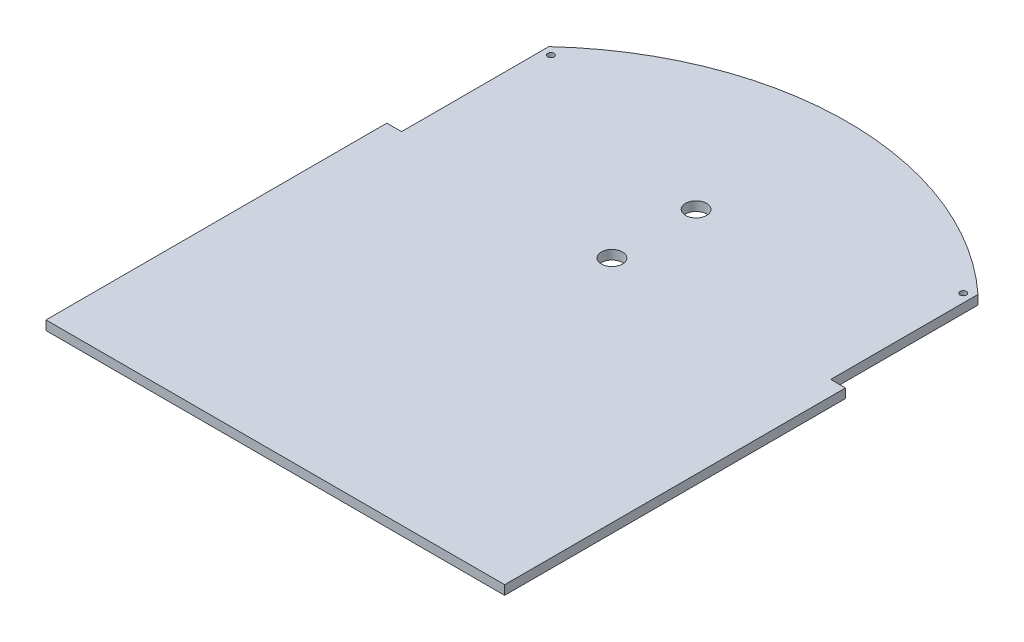
ISO-10303-21;
HEADER;
FILE_DESCRIPTION(('STEP AP214'),'2;1');
FILE_NAME('part.step','',(''),(''),'','','');
FILE_SCHEMA(('AUTOMOTIVE_DESIGN { 1 0 10303 214 1 1 1 1 }'));
ENDSEC;
DATA;
#1=APPLICATION_CONTEXT('core data for automotive mechanical design processes');
#2=APPLICATION_PROTOCOL_DEFINITION('international standard','automotive_design',2000,#1);
#3=PRODUCT_CONTEXT('',#1,'mechanical');
#4=PRODUCT('Part','Part','',(#3));
#5=PRODUCT_RELATED_PRODUCT_CATEGORY('part','',(#4));
#6=PRODUCT_DEFINITION_FORMATION('','',#4);
#7=PRODUCT_DEFINITION_CONTEXT('part definition',#1,'design');
#8=PRODUCT_DEFINITION('design','',#6,#7);
#9=PRODUCT_DEFINITION_SHAPE('','',#8);
#10=(LENGTH_UNIT() NAMED_UNIT(*) SI_UNIT(.MILLI.,.METRE.));
#11=(NAMED_UNIT(*) PLANE_ANGLE_UNIT() SI_UNIT($,.RADIAN.));
#12=(NAMED_UNIT(*) SI_UNIT($,.STERADIAN.) SOLID_ANGLE_UNIT());
#13=UNCERTAINTY_MEASURE_WITH_UNIT(LENGTH_MEASURE(1.E-05),#10,'distance_accuracy_value','');
#14=(GEOMETRIC_REPRESENTATION_CONTEXT(3) GLOBAL_UNCERTAINTY_ASSIGNED_CONTEXT((#13)) GLOBAL_UNIT_ASSIGNED_CONTEXT((#10,
#11,#12)) REPRESENTATION_CONTEXT('',''));
#15=CARTESIAN_POINT('',(0.,0.,0.));
#16=DIRECTION('',(0.,0.,1.));
#17=DIRECTION('',(1.,0.,0.));
#18=AXIS2_PLACEMENT_3D('',#15,#16,#17);
#19=CARTESIAN_POINT('',(0.,2.2,-60.975));
#20=DIRECTION('',(0.,-1.,0.));
#21=DIRECTION('',(0.,0.,-1.));
#22=AXIS2_PLACEMENT_3D('',#19,#20,#21);
#23=PLANE('',#22);
#24=CARTESIAN_POINT('',(-49.,2.2,-114.5));
#25=DIRECTION('',(0.,1.,0.));
#26=DIRECTION('',(0.,0.,1.));
#27=AXIS2_PLACEMENT_3D('',#24,#25,#26);
#28=CIRCLE('',#27,0.749999999999999);
#29=CARTESIAN_POINT('',(-49.,2.2,-113.75));
#30=VERTEX_POINT('',#29);
#31=EDGE_CURVE('E172',#30,#30,#28,.T.);
#32=ORIENTED_EDGE('',*,*,#31,.F.);
#33=EDGE_LOOP('',(#32));
#34=FACE_BOUND('',#33,.T.);
#35=CARTESIAN_POINT('',(0.,2.2,-100.));
#36=DIRECTION('',(0.,1.,0.));
#37=DIRECTION('',(0.,0.,1.));
#38=AXIS2_PLACEMENT_3D('',#35,#36,#37);
#39=CIRCLE('',#38,2.5);
#40=CARTESIAN_POINT('',(0.,2.2,-97.5));
#41=VERTEX_POINT('',#40);
#42=EDGE_CURVE('E191',#41,#41,#39,.T.);
#43=ORIENTED_EDGE('',*,*,#42,.F.);
#44=EDGE_LOOP('',(#43));
#45=FACE_BOUND('',#44,.T.);
#46=CARTESIAN_POINT('',(0.,2.2,-80.));
#47=DIRECTION('',(0.,1.,0.));
#48=DIRECTION('',(0.,0.,1.));
#49=AXIS2_PLACEMENT_3D('',#46,#47,#48);
#50=CIRCLE('',#49,2.5);
#51=CARTESIAN_POINT('',(0.,2.2,-77.5));
#52=VERTEX_POINT('',#51);
#53=EDGE_CURVE('E188',#52,#52,#50,.T.);
#54=ORIENTED_EDGE('',*,*,#53,.F.);
#55=EDGE_LOOP('',(#54));
#56=FACE_BOUND('',#55,.T.);
#57=DIRECTION('',(1.,0.,0.));
#58=VECTOR('',#57,1.);
#59=CARTESIAN_POINT('',(54.5,2.2,0.));
#60=LINE('',#59,#58);
#61=CARTESIAN_POINT('',(-54.5,2.2,0.));
#62=VERTEX_POINT('',#61);
#63=CARTESIAN_POINT('',(54.5,2.2,0.));
#64=VERTEX_POINT('',#63);
#65=EDGE_CURVE('E156',#62,#64,#60,.T.);
#66=ORIENTED_EDGE('',*,*,#65,.T.);
#67=DIRECTION('',(0.,0.,-1.));
#68=VECTOR('',#67,1.);
#69=CARTESIAN_POINT('',(54.5,2.2,-81.));
#70=LINE('',#69,#68);
#71=CARTESIAN_POINT('',(54.5,2.2,-81.));
#72=VERTEX_POINT('',#71);
#73=EDGE_CURVE('E104',#64,#72,#70,.T.);
#74=ORIENTED_EDGE('',*,*,#73,.T.);
#75=DIRECTION('',(-1.,0.,0.));
#76=VECTOR('',#75,1.);
#77=CARTESIAN_POINT('',(51.,2.2,-81.));
#78=LINE('',#77,#76);
#79=CARTESIAN_POINT('',(51.,2.2,-81.));
#80=VERTEX_POINT('',#79);
#81=EDGE_CURVE('E203',#72,#80,#78,.T.);
#82=ORIENTED_EDGE('',*,*,#81,.T.);
#83=DIRECTION('',(0.,0.,-1.));
#84=VECTOR('',#83,1.);
#85=CARTESIAN_POINT('',(51.,2.2,-116.));
#86=LINE('',#85,#84);
#87=CARTESIAN_POINT('',(51.,2.2,-116.));
#88=VERTEX_POINT('',#87);
#89=EDGE_CURVE('E205',#80,#88,#86,.T.);
#90=ORIENTED_EDGE('',*,*,#89,.T.);
#91=CARTESIAN_POINT('',(0.,2.2,-60.975));
#92=DIRECTION('',(0.,1.,0.));
#93=DIRECTION('',(0.,0.,-1.));
#94=AXIS2_PLACEMENT_3D('',#91,#92,#93);
#95=CIRCLE('',#94,75.025);
#96=CARTESIAN_POINT('',(-51.,2.2,-116.));
#97=VERTEX_POINT('',#96);
#98=EDGE_CURVE('E123',#88,#97,#95,.T.);
#99=ORIENTED_EDGE('',*,*,#98,.T.);
#100=DIRECTION('',(0.,0.,1.));
#101=VECTOR('',#100,1.);
#102=CARTESIAN_POINT('',(-51.,2.2,-81.));
#103=LINE('',#102,#101);
#104=CARTESIAN_POINT('',(-51.,2.2,-81.));
#105=VERTEX_POINT('',#104);
#106=EDGE_CURVE('E117',#97,#105,#103,.T.);
#107=ORIENTED_EDGE('',*,*,#106,.T.);
#108=DIRECTION('',(-1.,0.,0.));
#109=VECTOR('',#108,1.);
#110=CARTESIAN_POINT('',(-54.5,2.2,-81.));
#111=LINE('',#110,#109);
#112=CARTESIAN_POINT('',(-54.5,2.2,-81.));
#113=VERTEX_POINT('',#112);
#114=EDGE_CURVE('E121',#105,#113,#111,.T.);
#115=ORIENTED_EDGE('',*,*,#114,.T.);
#116=DIRECTION('',(0.,0.,1.));
#117=VECTOR('',#116,1.);
#118=CARTESIAN_POINT('',(-54.5,2.2,0.));
#119=LINE('',#118,#117);
#120=EDGE_CURVE('E61',#113,#62,#119,.T.);
#121=ORIENTED_EDGE('',*,*,#120,.T.);
#122=EDGE_LOOP('',(#66,#74,#82,#90,#99,#107,#115,#121));
#123=FACE_BOUND('',#122,.T.);
#124=CARTESIAN_POINT('',(49.,2.2,-114.5));
#125=DIRECTION('',(0.,-1.,0.));
#126=DIRECTION('',(0.,0.,1.));
#127=AXIS2_PLACEMENT_3D('',#124,#125,#126);
#128=CIRCLE('',#127,0.749999999999999);
#129=CARTESIAN_POINT('',(49.,2.2,-113.75));
#130=VERTEX_POINT('',#129);
#131=EDGE_CURVE('E189',#130,#130,#128,.T.);
#132=ORIENTED_EDGE('',*,*,#131,.T.);
#133=EDGE_LOOP('',(#132));
#134=FACE_BOUND('',#133,.T.);
#135=ADVANCED_FACE('F42',(#34,#45,#56,#123,#134),#23,.F.);
#136=CARTESIAN_POINT('',(0.,0.,-60.975));
#137=DIRECTION('',(0.,-1.,0.));
#138=DIRECTION('',(0.,0.,-1.));
#139=AXIS2_PLACEMENT_3D('',#136,#137,#138);
#140=PLANE('',#139);
#141=DIRECTION('',(1.,0.,0.));
#142=VECTOR('',#141,1.);
#143=CARTESIAN_POINT('',(54.5,0.,0.));
#144=LINE('',#143,#142);
#145=CARTESIAN_POINT('',(-54.5,0.,0.));
#146=VERTEX_POINT('',#145);
#147=CARTESIAN_POINT('',(54.5,0.,0.));
#148=VERTEX_POINT('',#147);
#149=EDGE_CURVE('E141',#146,#148,#144,.T.);
#150=ORIENTED_EDGE('',*,*,#149,.F.);
#151=DIRECTION('',(0.,0.,1.));
#152=VECTOR('',#151,1.);
#153=CARTESIAN_POINT('',(-54.5,0.,0.));
#154=LINE('',#153,#152);
#155=CARTESIAN_POINT('',(-54.5,0.,-81.));
#156=VERTEX_POINT('',#155);
#157=EDGE_CURVE('E96',#156,#146,#154,.T.);
#158=ORIENTED_EDGE('',*,*,#157,.F.);
#159=DIRECTION('',(-1.,0.,0.));
#160=VECTOR('',#159,1.);
#161=CARTESIAN_POINT('',(-54.5,0.,-81.));
#162=LINE('',#161,#160);
#163=CARTESIAN_POINT('',(-51.,0.,-81.));
#164=VERTEX_POINT('',#163);
#165=EDGE_CURVE('E90',#164,#156,#162,.T.);
#166=ORIENTED_EDGE('',*,*,#165,.F.);
#167=DIRECTION('',(0.,0.,1.));
#168=VECTOR('',#167,1.);
#169=CARTESIAN_POINT('',(-51.,0.,-81.));
#170=LINE('',#169,#168);
#171=CARTESIAN_POINT('',(-51.,0.,-116.));
#172=VERTEX_POINT('',#171);
#173=EDGE_CURVE('E131',#172,#164,#170,.T.);
#174=ORIENTED_EDGE('',*,*,#173,.F.);
#175=CARTESIAN_POINT('',(0.,0.,-60.975));
#176=DIRECTION('',(0.,1.,0.));
#177=DIRECTION('',(0.,0.,-1.));
#178=AXIS2_PLACEMENT_3D('',#175,#176,#177);
#179=CIRCLE('',#178,75.025);
#180=CARTESIAN_POINT('',(51.,0.,-116.));
#181=VERTEX_POINT('',#180);
#182=EDGE_CURVE('E151',#181,#172,#179,.T.);
#183=ORIENTED_EDGE('',*,*,#182,.F.);
#184=DIRECTION('',(0.,0.,-1.));
#185=VECTOR('',#184,1.);
#186=CARTESIAN_POINT('',(51.,0.,-116.));
#187=LINE('',#186,#185);
#188=CARTESIAN_POINT('',(51.,0.,-81.));
#189=VERTEX_POINT('',#188);
#190=EDGE_CURVE('E149',#189,#181,#187,.T.);
#191=ORIENTED_EDGE('',*,*,#190,.F.);
#192=DIRECTION('',(-1.,0.,0.));
#193=VECTOR('',#192,1.);
#194=CARTESIAN_POINT('',(51.,0.,-81.));
#195=LINE('',#194,#193);
#196=CARTESIAN_POINT('',(54.5,0.,-81.));
#197=VERTEX_POINT('',#196);
#198=EDGE_CURVE('E147',#197,#189,#195,.T.);
#199=ORIENTED_EDGE('',*,*,#198,.F.);
#200=DIRECTION('',(0.,0.,-1.));
#201=VECTOR('',#200,1.);
#202=CARTESIAN_POINT('',(54.5,0.,-81.));
#203=LINE('',#202,#201);
#204=EDGE_CURVE('E144',#148,#197,#203,.T.);
#205=ORIENTED_EDGE('',*,*,#204,.F.);
#206=EDGE_LOOP('',(#150,#158,#166,#174,#183,#191,#199,#205));
#207=FACE_BOUND('',#206,.T.);
#208=CARTESIAN_POINT('',(0.,0.,-80.));
#209=DIRECTION('',(0.,-1.,0.));
#210=DIRECTION('',(0.,0.,-1.));
#211=AXIS2_PLACEMENT_3D('',#208,#209,#210);
#212=CIRCLE('',#211,2.5);
#213=CARTESIAN_POINT('',(0.,0.,-82.5));
#214=VERTEX_POINT('',#213);
#215=EDGE_CURVE('E168',#214,#214,#212,.T.);
#216=ORIENTED_EDGE('',*,*,#215,.F.);
#217=EDGE_LOOP('',(#216));
#218=FACE_BOUND('',#217,.T.);
#219=CARTESIAN_POINT('',(0.,0.,-100.));
#220=DIRECTION('',(0.,-1.,0.));
#221=DIRECTION('',(0.,0.,-1.));
#222=AXIS2_PLACEMENT_3D('',#219,#220,#221);
#223=CIRCLE('',#222,2.5);
#224=CARTESIAN_POINT('',(0.,0.,-102.5));
#225=VERTEX_POINT('',#224);
#226=EDGE_CURVE('E171',#225,#225,#223,.T.);
#227=ORIENTED_EDGE('',*,*,#226,.F.);
#228=EDGE_LOOP('',(#227));
#229=FACE_BOUND('',#228,.T.);
#230=CARTESIAN_POINT('',(-49.,0.,-114.5));
#231=DIRECTION('',(0.,-1.,0.));
#232=DIRECTION('',(0.,0.,-1.));
#233=AXIS2_PLACEMENT_3D('',#230,#231,#232);
#234=CIRCLE('',#233,0.749999999999999);
#235=CARTESIAN_POINT('',(-49.,0.,-115.25));
#236=VERTEX_POINT('',#235);
#237=EDGE_CURVE('E145',#236,#236,#234,.T.);
#238=ORIENTED_EDGE('',*,*,#237,.F.);
#239=EDGE_LOOP('',(#238));
#240=FACE_BOUND('',#239,.T.);
#241=CARTESIAN_POINT('',(49.,0.,-114.5));
#242=DIRECTION('',(0.,-1.,0.));
#243=DIRECTION('',(0.,0.,-1.));
#244=AXIS2_PLACEMENT_3D('',#241,#242,#243);
#245=CIRCLE('',#244,0.749999999999999);
#246=CARTESIAN_POINT('',(49.,0.,-115.25));
#247=VERTEX_POINT('',#246);
#248=EDGE_CURVE('E46',#247,#247,#245,.F.);
#249=ORIENTED_EDGE('',*,*,#248,.T.);
#250=EDGE_LOOP('',(#249));
#251=FACE_BOUND('',#250,.T.);
#252=ADVANCED_FACE('F180',(#207,#218,#229,#240,#251),#140,.T.);
#253=CARTESIAN_POINT('',(54.5,2.2,0.));
#254=DIRECTION('',(0.,0.,-1.));
#255=DIRECTION('',(-1.,0.,0.));
#256=AXIS2_PLACEMENT_3D('',#253,#254,#255);
#257=PLANE('',#256);
#258=ORIENTED_EDGE('',*,*,#149,.T.);
#259=DIRECTION('',(0.,-1.,0.));
#260=VECTOR('',#259,1.);
#261=CARTESIAN_POINT('',(54.5,2.2,0.));
#262=LINE('',#261,#260);
#263=EDGE_CURVE('E11',#64,#148,#262,.T.);
#264=ORIENTED_EDGE('',*,*,#263,.F.);
#265=ORIENTED_EDGE('',*,*,#65,.F.);
#266=DIRECTION('',(0.,-1.,0.));
#267=VECTOR('',#266,1.);
#268=CARTESIAN_POINT('',(-54.5,2.2,0.));
#269=LINE('',#268,#267);
#270=EDGE_CURVE('E137',#62,#146,#269,.T.);
#271=ORIENTED_EDGE('',*,*,#270,.T.);
#272=EDGE_LOOP('',(#258,#264,#265,#271));
#273=FACE_BOUND('',#272,.T.);
#274=ADVANCED_FACE('F44',(#273),#257,.F.);
#275=CARTESIAN_POINT('',(54.5,2.2,-81.));
#276=DIRECTION('',(-1.,0.,0.));
#277=DIRECTION('',(0.,0.,1.));
#278=AXIS2_PLACEMENT_3D('',#275,#276,#277);
#279=PLANE('',#278);
#280=ORIENTED_EDGE('',*,*,#204,.T.);
#281=DIRECTION('',(0.,-1.,0.));
#282=VECTOR('',#281,1.);
#283=CARTESIAN_POINT('',(54.5,2.2,-81.));
#284=LINE('',#283,#282);
#285=EDGE_CURVE('E52',#72,#197,#284,.T.);
#286=ORIENTED_EDGE('',*,*,#285,.F.);
#287=ORIENTED_EDGE('',*,*,#73,.F.);
#288=ORIENTED_EDGE('',*,*,#263,.T.);
#289=EDGE_LOOP('',(#280,#286,#287,#288));
#290=FACE_BOUND('',#289,.T.);
#291=ADVANCED_FACE('F308',(#290),#279,.F.);
#292=CARTESIAN_POINT('',(51.,2.2,-81.));
#293=DIRECTION('',(0.,0.,1.));
#294=DIRECTION('',(1.,0.,0.));
#295=AXIS2_PLACEMENT_3D('',#292,#293,#294);
#296=PLANE('',#295);
#297=ORIENTED_EDGE('',*,*,#198,.T.);
#298=DIRECTION('',(0.,-1.,0.));
#299=VECTOR('',#298,1.);
#300=CARTESIAN_POINT('',(51.,2.2,-81.));
#301=LINE('',#300,#299);
#302=EDGE_CURVE('E163',#80,#189,#301,.T.);
#303=ORIENTED_EDGE('',*,*,#302,.F.);
#304=ORIENTED_EDGE('',*,*,#81,.F.);
#305=ORIENTED_EDGE('',*,*,#285,.T.);
#306=EDGE_LOOP('',(#297,#303,#304,#305));
#307=FACE_BOUND('',#306,.T.);
#308=ADVANCED_FACE('F299',(#307),#296,.F.);
#309=CARTESIAN_POINT('',(51.,2.2,-116.));
#310=DIRECTION('',(-1.,0.,0.));
#311=DIRECTION('',(0.,0.,1.));
#312=AXIS2_PLACEMENT_3D('',#309,#310,#311);
#313=PLANE('',#312);
#314=ORIENTED_EDGE('',*,*,#190,.T.);
#315=DIRECTION('',(0.,-1.,0.));
#316=VECTOR('',#315,1.);
#317=CARTESIAN_POINT('',(51.,2.2,-116.));
#318=LINE('',#317,#316);
#319=EDGE_CURVE('E160',#88,#181,#318,.T.);
#320=ORIENTED_EDGE('',*,*,#319,.F.);
#321=ORIENTED_EDGE('',*,*,#89,.F.);
#322=ORIENTED_EDGE('',*,*,#302,.T.);
#323=EDGE_LOOP('',(#314,#320,#321,#322));
#324=FACE_BOUND('',#323,.T.);
#325=ADVANCED_FACE('F211',(#324),#313,.F.);
#326=CARTESIAN_POINT('',(0.,2.2,-60.975));
#327=DIRECTION('',(0.,-1.,0.));
#328=DIRECTION('',(0.,0.,-1.));
#329=AXIS2_PLACEMENT_3D('',#326,#327,#328);
#330=CYLINDRICAL_SURFACE('',#329,75.025);
#331=ORIENTED_EDGE('',*,*,#182,.T.);
#332=DIRECTION('',(0.,-1.,0.));
#333=VECTOR('',#332,1.);
#334=CARTESIAN_POINT('',(-51.,2.2,-116.));
#335=LINE('',#334,#333);
#336=EDGE_CURVE('E132',#97,#172,#335,.T.);
#337=ORIENTED_EDGE('',*,*,#336,.F.);
#338=ORIENTED_EDGE('',*,*,#98,.F.);
#339=ORIENTED_EDGE('',*,*,#319,.T.);
#340=EDGE_LOOP('',(#331,#337,#338,#339));
#341=FACE_BOUND('',#340,.T.);
#342=ADVANCED_FACE('F215',(#341),#330,.T.);
#343=CARTESIAN_POINT('',(-51.,2.2,-81.));
#344=DIRECTION('',(1.,0.,0.));
#345=DIRECTION('',(0.,0.,-1.));
#346=AXIS2_PLACEMENT_3D('',#343,#344,#345);
#347=PLANE('',#346);
#348=ORIENTED_EDGE('',*,*,#173,.T.);
#349=DIRECTION('',(0.,-1.,0.));
#350=VECTOR('',#349,1.);
#351=CARTESIAN_POINT('',(-51.,2.2,-81.));
#352=LINE('',#351,#350);
#353=EDGE_CURVE('E128',#105,#164,#352,.T.);
#354=ORIENTED_EDGE('',*,*,#353,.F.);
#355=ORIENTED_EDGE('',*,*,#106,.F.);
#356=ORIENTED_EDGE('',*,*,#336,.T.);
#357=EDGE_LOOP('',(#348,#354,#355,#356));
#358=FACE_BOUND('',#357,.T.);
#359=ADVANCED_FACE('F129',(#358),#347,.F.);
#360=CARTESIAN_POINT('',(-54.5,2.2,-81.));
#361=DIRECTION('',(0.,0.,1.));
#362=DIRECTION('',(1.,0.,0.));
#363=AXIS2_PLACEMENT_3D('',#360,#361,#362);
#364=PLANE('',#363);
#365=ORIENTED_EDGE('',*,*,#165,.T.);
#366=DIRECTION('',(0.,-1.,0.));
#367=VECTOR('',#366,1.);
#368=CARTESIAN_POINT('',(-54.5,2.2,-81.));
#369=LINE('',#368,#367);
#370=EDGE_CURVE('E133',#113,#156,#369,.T.);
#371=ORIENTED_EDGE('',*,*,#370,.F.);
#372=ORIENTED_EDGE('',*,*,#114,.F.);
#373=ORIENTED_EDGE('',*,*,#353,.T.);
#374=EDGE_LOOP('',(#365,#371,#372,#373));
#375=FACE_BOUND('',#374,.T.);
#376=ADVANCED_FACE('F135',(#375),#364,.F.);
#377=CARTESIAN_POINT('',(-54.5,2.2,0.));
#378=DIRECTION('',(1.,0.,0.));
#379=DIRECTION('',(0.,0.,-1.));
#380=AXIS2_PLACEMENT_3D('',#377,#378,#379);
#381=PLANE('',#380);
#382=ORIENTED_EDGE('',*,*,#157,.T.);
#383=ORIENTED_EDGE('',*,*,#270,.F.);
#384=ORIENTED_EDGE('',*,*,#120,.F.);
#385=ORIENTED_EDGE('',*,*,#370,.T.);
#386=EDGE_LOOP('',(#382,#383,#384,#385));
#387=FACE_BOUND('',#386,.T.);
#388=ADVANCED_FACE('F222',(#387),#381,.F.);
#389=CARTESIAN_POINT('',(0.,-7.8,-80.));
#390=DIRECTION('',(0.,1.,0.));
#391=DIRECTION('',(0.,0.,1.));
#392=AXIS2_PLACEMENT_3D('',#389,#390,#391);
#393=CYLINDRICAL_SURFACE('',#392,2.5);
#394=ORIENTED_EDGE('',*,*,#215,.T.);
#395=EDGE_LOOP('',(#394));
#396=FACE_BOUND('',#395,.T.);
#397=ORIENTED_EDGE('',*,*,#53,.T.);
#398=EDGE_LOOP('',(#397));
#399=FACE_BOUND('',#398,.T.);
#400=ADVANCED_FACE('F224',(#396,#399),#393,.F.);
#401=CARTESIAN_POINT('',(0.,-7.8,-100.));
#402=DIRECTION('',(0.,1.,0.));
#403=DIRECTION('',(0.,0.,1.));
#404=AXIS2_PLACEMENT_3D('',#401,#402,#403);
#405=CYLINDRICAL_SURFACE('',#404,2.5);
#406=ORIENTED_EDGE('',*,*,#226,.T.);
#407=EDGE_LOOP('',(#406));
#408=FACE_BOUND('',#407,.T.);
#409=ORIENTED_EDGE('',*,*,#42,.T.);
#410=EDGE_LOOP('',(#409));
#411=FACE_BOUND('',#410,.T.);
#412=ADVANCED_FACE('F230',(#408,#411),#405,.F.);
#413=CARTESIAN_POINT('',(-49.,-7.8,-114.5));
#414=DIRECTION('',(0.,1.,0.));
#415=DIRECTION('',(0.,0.,1.));
#416=AXIS2_PLACEMENT_3D('',#413,#414,#415);
#417=CYLINDRICAL_SURFACE('',#416,0.749999999999999);
#418=ORIENTED_EDGE('',*,*,#237,.T.);
#419=EDGE_LOOP('',(#418));
#420=FACE_BOUND('',#419,.T.);
#421=ORIENTED_EDGE('',*,*,#31,.T.);
#422=EDGE_LOOP('',(#421));
#423=FACE_BOUND('',#422,.T.);
#424=ADVANCED_FACE('F177',(#420,#423),#417,.F.);
#425=CARTESIAN_POINT('',(49.,-7.8,-114.5));
#426=DIRECTION('',(0.,1.,0.));
#427=DIRECTION('',(0.,0.,1.));
#428=AXIS2_PLACEMENT_3D('',#425,#426,#427);
#429=CYLINDRICAL_SURFACE('',#428,0.749999999999999);
#430=ORIENTED_EDGE('',*,*,#248,.F.);
#431=EDGE_LOOP('',(#430));
#432=FACE_BOUND('',#431,.T.);
#433=ORIENTED_EDGE('',*,*,#131,.F.);
#434=EDGE_LOOP('',(#433));
#435=FACE_BOUND('',#434,.T.);
#436=ADVANCED_FACE('F247',(#432,#435),#429,.F.);
#437=CLOSED_SHELL('',(#135,#252,#274,#291,#308,#325,#342,#359,#376,#388,#400,#412,#424,#436));
#438=MANIFOLD_SOLID_BREP('B2',#437);
#439=ADVANCED_BREP_SHAPE_REPRESENTATION('',(#18,#438),#14);
#440=SHAPE_DEFINITION_REPRESENTATION(#9,#439);
ENDSEC;
END-ISO-10303-21;
